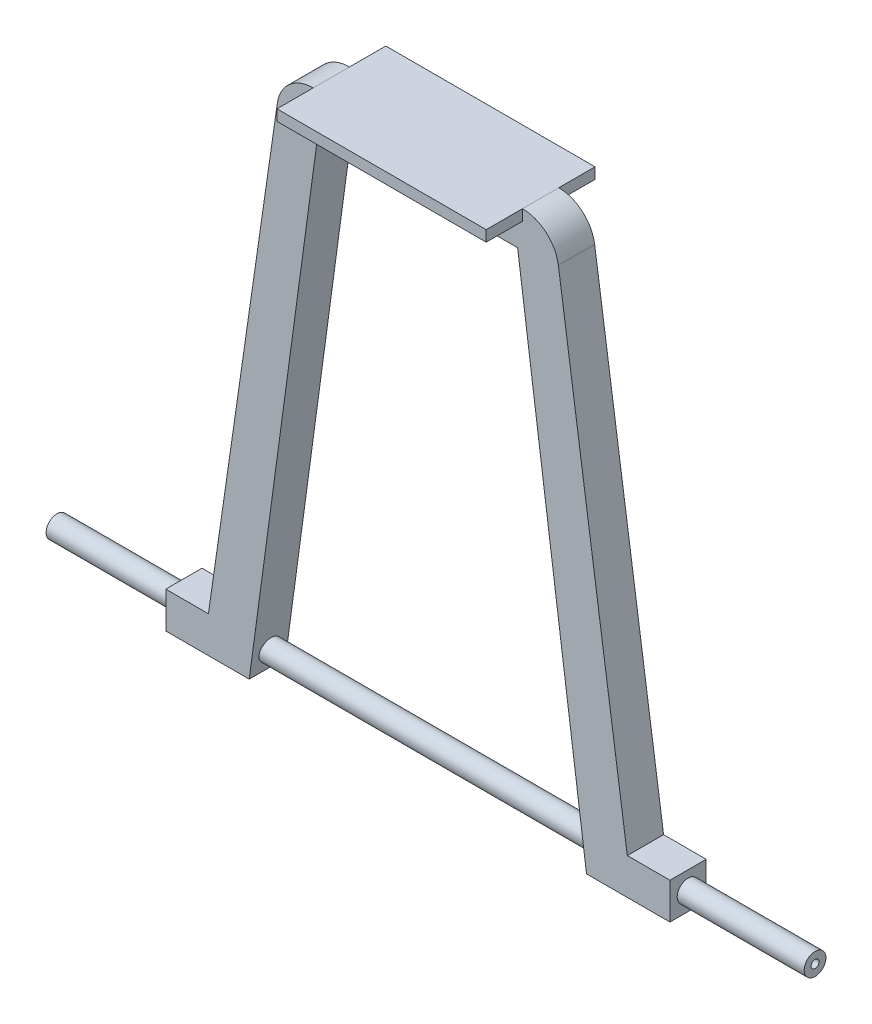
ISO-10303-21;
HEADER;
FILE_DESCRIPTION(('STEP AP214'),'2;1');
FILE_NAME('part.step','',(''),(''),'','','');
FILE_SCHEMA(('AUTOMOTIVE_DESIGN { 1 0 10303 214 1 1 1 1 }'));
ENDSEC;
DATA;
#1=APPLICATION_CONTEXT('core data for automotive mechanical design processes');
#2=APPLICATION_PROTOCOL_DEFINITION('international standard','automotive_design',2000,#1);
#3=PRODUCT_CONTEXT('',#1,'mechanical');
#4=PRODUCT('Part','Part','',(#3));
#5=PRODUCT_RELATED_PRODUCT_CATEGORY('part','',(#4));
#6=PRODUCT_DEFINITION_FORMATION('','',#4);
#7=PRODUCT_DEFINITION_CONTEXT('part definition',#1,'design');
#8=PRODUCT_DEFINITION('design','',#6,#7);
#9=PRODUCT_DEFINITION_SHAPE('','',#8);
#10=(LENGTH_UNIT() NAMED_UNIT(*) SI_UNIT(.MILLI.,.METRE.));
#11=(NAMED_UNIT(*) PLANE_ANGLE_UNIT() SI_UNIT($,.RADIAN.));
#12=(NAMED_UNIT(*) SI_UNIT($,.STERADIAN.) SOLID_ANGLE_UNIT());
#13=UNCERTAINTY_MEASURE_WITH_UNIT(LENGTH_MEASURE(1.E-05),#10,'distance_accuracy_value','');
#14=(GEOMETRIC_REPRESENTATION_CONTEXT(3) GLOBAL_UNCERTAINTY_ASSIGNED_CONTEXT((#13)) GLOBAL_UNIT_ASSIGNED_CONTEXT((#10,
#11,#12)) REPRESENTATION_CONTEXT('',''));
#15=CARTESIAN_POINT('',(0.,0.,0.));
#16=DIRECTION('',(0.,0.,1.));
#17=DIRECTION('',(1.,0.,0.));
#18=AXIS2_PLACEMENT_3D('',#15,#16,#17);
#19=CARTESIAN_POINT('',(0.,0.,10.));
#20=DIRECTION('',(0.,0.,-1.));
#21=DIRECTION('',(-1.,0.,0.));
#22=AXIS2_PLACEMENT_3D('',#19,#20,#21);
#23=PLANE('',#22);
#24=DIRECTION('',(0.,-1.,0.));
#25=VECTOR('',#24,1.);
#26=CARTESIAN_POINT('',(97.,0.,10.));
#27=LINE('',#26,#25);
#28=CARTESIAN_POINT('',(97.,-130.,10.));
#29=VERTEX_POINT('',#28);
#30=CARTESIAN_POINT('',(97.,-140.,10.));
#31=VERTEX_POINT('',#30);
#32=EDGE_CURVE('E181',#29,#31,#27,.T.);
#33=ORIENTED_EDGE('',*,*,#32,.F.);
#34=DIRECTION('',(-1.,0.,0.));
#35=VECTOR('',#34,1.);
#36=CARTESIAN_POINT('',(132.,-130.,10.));
#37=LINE('',#36,#35);
#38=CARTESIAN_POINT('',(85.2425475761112,-130.,10.));
#39=VERTEX_POINT('',#38);
#40=EDGE_CURVE('E191',#29,#39,#37,.T.);
#41=ORIENTED_EDGE('',*,*,#40,.T.);
#42=DIRECTION('',(0.143101511466158,-0.989708016243226,0.));
#43=VECTOR('',#42,1.);
#44=CARTESIAN_POINT('',(66.2389863158603,1.43101511466158,10.));
#45=LINE('',#44,#43);
#46=CARTESIAN_POINT('',(66.2389863158603,1.43101511466158,10.));
#47=VERTEX_POINT('',#46);
#48=EDGE_CURVE('E234',#47,#39,#45,.T.);
#49=ORIENTED_EDGE('',*,*,#48,.F.);
#50=CARTESIAN_POINT('',(56.341906153428,0.,10.));
#51=DIRECTION('',(0.,0.,1.));
#52=DIRECTION('',(1.,0.,0.));
#53=AXIS2_PLACEMENT_3D('',#50,#51,#52);
#54=CIRCLE('',#53,10.);
#55=CARTESIAN_POINT('',(56.341906153428,10.,10.));
#56=VERTEX_POINT('',#55);
#57=EDGE_CURVE('E208',#47,#56,#54,.T.);
#58=ORIENTED_EDGE('',*,*,#57,.T.);
#59=DIRECTION('',(0.,-1.,0.));
#60=VECTOR('',#59,1.);
#61=CARTESIAN_POINT('',(56.341906153428,0.,10.));
#62=LINE('',#61,#60);
#63=CARTESIAN_POINT('',(56.341906153428,7.,10.));
#64=VERTEX_POINT('',#63);
#65=EDGE_CURVE('E348',#56,#64,#62,.T.);
#66=ORIENTED_EDGE('',*,*,#65,.T.);
#67=DIRECTION('',(1.,0.,0.));
#68=VECTOR('',#67,1.);
#69=CARTESIAN_POINT('',(0.,7.,10.));
#70=LINE('',#69,#68);
#71=CARTESIAN_POINT('',(-1.34190615342804,7.,10.));
#72=VERTEX_POINT('',#71);
#73=EDGE_CURVE('E336',#72,#64,#70,.T.);
#74=ORIENTED_EDGE('',*,*,#73,.F.);
#75=DIRECTION('',(0.,1.,0.));
#76=VECTOR('',#75,1.);
#77=CARTESIAN_POINT('',(-1.34190615342803,0.,10.));
#78=LINE('',#77,#76);
#79=CARTESIAN_POINT('',(-1.34190615342803,10.,10.));
#80=VERTEX_POINT('',#79);
#81=EDGE_CURVE('E339',#72,#80,#78,.T.);
#82=ORIENTED_EDGE('',*,*,#81,.T.);
#83=CARTESIAN_POINT('',(-1.34190615342803,0.,10.));
#84=DIRECTION('',(0.,0.,-1.));
#85=DIRECTION('',(-1.,0.,0.));
#86=AXIS2_PLACEMENT_3D('',#83,#84,#85);
#87=CIRCLE('',#86,10.);
#88=CARTESIAN_POINT('',(-11.2389863158603,1.43101511466158,10.));
#89=VERTEX_POINT('',#88);
#90=EDGE_CURVE('E250',#89,#80,#87,.T.);
#91=ORIENTED_EDGE('',*,*,#90,.F.);
#92=DIRECTION('',(-0.143101511466158,-0.989708016243226,0.));
#93=VECTOR('',#92,1.);
#94=CARTESIAN_POINT('',(-11.2389863158603,1.43101511466158,10.));
#95=LINE('',#94,#93);
#96=CARTESIAN_POINT('',(-30.2425475761112,-130.,10.));
#97=VERTEX_POINT('',#96);
#98=EDGE_CURVE('E256',#89,#97,#95,.T.);
#99=ORIENTED_EDGE('',*,*,#98,.T.);
#100=DIRECTION('',(1.,0.,0.));
#101=VECTOR('',#100,1.);
#102=CARTESIAN_POINT('',(-77.,-130.,10.));
#103=LINE('',#102,#101);
#104=CARTESIAN_POINT('',(-42.,-130.,10.));
#105=VERTEX_POINT('',#104);
#106=EDGE_CURVE('E204',#105,#97,#103,.T.);
#107=ORIENTED_EDGE('',*,*,#106,.F.);
#108=DIRECTION('',(0.,1.,0.));
#109=VECTOR('',#108,1.);
#110=CARTESIAN_POINT('',(-42.,0.,10.));
#111=LINE('',#110,#109);
#112=CARTESIAN_POINT('',(-42.,-140.,10.));
#113=VERTEX_POINT('',#112);
#114=EDGE_CURVE('E68',#113,#105,#111,.T.);
#115=ORIENTED_EDGE('',*,*,#114,.F.);
#116=DIRECTION('',(1.,0.,0.));
#117=VECTOR('',#116,1.);
#118=CARTESIAN_POINT('',(-31.6884438315477,-140.,10.));
#119=LINE('',#118,#117);
#120=CARTESIAN_POINT('',(-18.9930433860189,-140.,10.));
#121=VERTEX_POINT('',#120);
#122=EDGE_CURVE('E274',#113,#121,#119,.T.);
#123=ORIENTED_EDGE('',*,*,#122,.T.);
#124=DIRECTION('',(-0.134433123138436,-0.990922668730132,0.));
#125=VECTOR('',#124,1.);
#126=CARTESIAN_POINT('',(0.,0.,10.));
#127=LINE('',#126,#125);
#128=CARTESIAN_POINT('',(0.,0.,10.));
#129=VERTEX_POINT('',#128);
#130=EDGE_CURVE('E270',#129,#121,#127,.T.);
#131=ORIENTED_EDGE('',*,*,#130,.F.);
#132=DIRECTION('',(1.,0.,0.));
#133=VECTOR('',#132,1.);
#134=CARTESIAN_POINT('',(0.,0.,10.));
#135=LINE('',#134,#133);
#136=CARTESIAN_POINT('',(55.,0.,10.));
#137=VERTEX_POINT('',#136);
#138=EDGE_CURVE('E291',#129,#137,#135,.T.);
#139=ORIENTED_EDGE('',*,*,#138,.T.);
#140=DIRECTION('',(0.134433123138436,-0.990922668730132,0.));
#141=VECTOR('',#140,1.);
#142=CARTESIAN_POINT('',(55.,0.,10.));
#143=LINE('',#142,#141);
#144=CARTESIAN_POINT('',(73.9930433860189,-140.,10.));
#145=VERTEX_POINT('',#144);
#146=EDGE_CURVE('E219',#137,#145,#143,.T.);
#147=ORIENTED_EDGE('',*,*,#146,.T.);
#148=DIRECTION('',(-1.,0.,0.));
#149=VECTOR('',#148,1.);
#150=CARTESIAN_POINT('',(86.6884438315477,-140.,10.));
#151=LINE('',#150,#149);
#152=EDGE_CURVE('E194',#31,#145,#151,.T.);
#153=ORIENTED_EDGE('',*,*,#152,.F.);
#154=EDGE_LOOP('',(#33,#41,#49,#58,#66,#74,#82,#91,#99,#107,#115,#123,#131,#139,#147,#153));
#155=FACE_BOUND('',#154,.T.);
#156=ADVANCED_FACE('F42',(#155),#23,.F.);
#157=CARTESIAN_POINT('',(0.,0.,0.));
#158=DIRECTION('',(0.,0.,-1.));
#159=DIRECTION('',(-1.,0.,0.));
#160=AXIS2_PLACEMENT_3D('',#157,#158,#159);
#161=PLANE('',#160);
#162=DIRECTION('',(-1.,0.,0.));
#163=VECTOR('',#162,1.);
#164=CARTESIAN_POINT('',(132.,-130.,0.));
#165=LINE('',#164,#163);
#166=CARTESIAN_POINT('',(97.,-130.,0.));
#167=VERTEX_POINT('',#166);
#168=CARTESIAN_POINT('',(85.2425475761111,-130.,0.));
#169=VERTEX_POINT('',#168);
#170=EDGE_CURVE('E203',#167,#169,#165,.T.);
#171=ORIENTED_EDGE('',*,*,#170,.F.);
#172=DIRECTION('',(0.,-1.,0.));
#173=VECTOR('',#172,1.);
#174=CARTESIAN_POINT('',(97.,0.,0.));
#175=LINE('',#174,#173);
#176=CARTESIAN_POINT('',(97.,-140.,0.));
#177=VERTEX_POINT('',#176);
#178=EDGE_CURVE('E60',#167,#177,#175,.T.);
#179=ORIENTED_EDGE('',*,*,#178,.T.);
#180=DIRECTION('',(-1.,0.,0.));
#181=VECTOR('',#180,1.);
#182=CARTESIAN_POINT('',(86.6884438315477,-140.,0.));
#183=LINE('',#182,#181);
#184=CARTESIAN_POINT('',(73.9930433860189,-140.,0.));
#185=VERTEX_POINT('',#184);
#186=EDGE_CURVE('E223',#177,#185,#183,.T.);
#187=ORIENTED_EDGE('',*,*,#186,.T.);
#188=DIRECTION('',(0.134433123138436,-0.990922668730132,0.));
#189=VECTOR('',#188,1.);
#190=CARTESIAN_POINT('',(55.,0.,0.));
#191=LINE('',#190,#189);
#192=CARTESIAN_POINT('',(55.,0.,0.));
#193=VERTEX_POINT('',#192);
#194=EDGE_CURVE('E226',#193,#185,#191,.T.);
#195=ORIENTED_EDGE('',*,*,#194,.F.);
#196=DIRECTION('',(1.,0.,0.));
#197=VECTOR('',#196,1.);
#198=CARTESIAN_POINT('',(0.,0.,0.));
#199=LINE('',#198,#197);
#200=CARTESIAN_POINT('',(0.,0.,0.));
#201=VERTEX_POINT('',#200);
#202=EDGE_CURVE('E290',#201,#193,#199,.T.);
#203=ORIENTED_EDGE('',*,*,#202,.F.);
#204=DIRECTION('',(-0.134433123138436,-0.990922668730132,0.));
#205=VECTOR('',#204,1.);
#206=CARTESIAN_POINT('',(0.,0.,0.));
#207=LINE('',#206,#205);
#208=CARTESIAN_POINT('',(-18.9930433860189,-140.,0.));
#209=VERTEX_POINT('',#208);
#210=EDGE_CURVE('E255',#201,#209,#207,.T.);
#211=ORIENTED_EDGE('',*,*,#210,.T.);
#212=DIRECTION('',(1.,0.,0.));
#213=VECTOR('',#212,1.);
#214=CARTESIAN_POINT('',(-31.6884438315477,-140.,0.));
#215=LINE('',#214,#213);
#216=CARTESIAN_POINT('',(-42.,-140.,0.));
#217=VERTEX_POINT('',#216);
#218=EDGE_CURVE('E260',#217,#209,#215,.T.);
#219=ORIENTED_EDGE('',*,*,#218,.F.);
#220=DIRECTION('',(0.,1.,0.));
#221=VECTOR('',#220,1.);
#222=CARTESIAN_POINT('',(-42.,0.,0.));
#223=LINE('',#222,#221);
#224=CARTESIAN_POINT('',(-42.,-130.,0.));
#225=VERTEX_POINT('',#224);
#226=EDGE_CURVE('E334',#217,#225,#223,.T.);
#227=ORIENTED_EDGE('',*,*,#226,.T.);
#228=DIRECTION('',(1.,0.,0.));
#229=VECTOR('',#228,1.);
#230=CARTESIAN_POINT('',(-77.,-130.,0.));
#231=LINE('',#230,#229);
#232=CARTESIAN_POINT('',(-30.2425475761112,-130.,0.));
#233=VERTEX_POINT('',#232);
#234=EDGE_CURVE('E210',#225,#233,#231,.T.);
#235=ORIENTED_EDGE('',*,*,#234,.T.);
#236=DIRECTION('',(-0.143101511466158,-0.989708016243226,0.));
#237=VECTOR('',#236,1.);
#238=CARTESIAN_POINT('',(-11.2389863158603,1.43101511466158,0.));
#239=LINE('',#238,#237);
#240=CARTESIAN_POINT('',(-11.2389863158603,1.43101511466158,0.));
#241=VERTEX_POINT('',#240);
#242=EDGE_CURVE('E263',#241,#233,#239,.T.);
#243=ORIENTED_EDGE('',*,*,#242,.F.);
#244=CARTESIAN_POINT('',(-1.34190615342803,0.,0.));
#245=DIRECTION('',(0.,0.,-1.));
#246=DIRECTION('',(-1.,0.,0.));
#247=AXIS2_PLACEMENT_3D('',#244,#245,#246);
#248=CIRCLE('',#247,10.);
#249=CARTESIAN_POINT('',(-1.34190615342804,10.,0.));
#250=VERTEX_POINT('',#249);
#251=EDGE_CURVE('E251',#241,#250,#248,.T.);
#252=ORIENTED_EDGE('',*,*,#251,.T.);
#253=DIRECTION('',(0.,1.,0.));
#254=VECTOR('',#253,1.);
#255=CARTESIAN_POINT('',(-1.34190615342803,0.,0.));
#256=LINE('',#255,#254);
#257=CARTESIAN_POINT('',(-1.34190615342803,7.,0.));
#258=VERTEX_POINT('',#257);
#259=EDGE_CURVE('E344',#258,#250,#256,.T.);
#260=ORIENTED_EDGE('',*,*,#259,.F.);
#261=DIRECTION('',(1.,0.,0.));
#262=VECTOR('',#261,1.);
#263=CARTESIAN_POINT('',(0.,7.,0.));
#264=LINE('',#263,#262);
#265=CARTESIAN_POINT('',(56.341906153428,7.,0.));
#266=VERTEX_POINT('',#265);
#267=EDGE_CURVE('E310',#258,#266,#264,.T.);
#268=ORIENTED_EDGE('',*,*,#267,.T.);
#269=DIRECTION('',(0.,-1.,0.));
#270=VECTOR('',#269,1.);
#271=CARTESIAN_POINT('',(56.341906153428,0.,0.));
#272=LINE('',#271,#270);
#273=CARTESIAN_POINT('',(56.341906153428,10.,0.));
#274=VERTEX_POINT('',#273);
#275=EDGE_CURVE('E351',#274,#266,#272,.T.);
#276=ORIENTED_EDGE('',*,*,#275,.F.);
#277=CARTESIAN_POINT('',(56.341906153428,0.,0.));
#278=DIRECTION('',(0.,0.,1.));
#279=DIRECTION('',(1.,0.,0.));
#280=AXIS2_PLACEMENT_3D('',#277,#278,#279);
#281=CIRCLE('',#280,10.);
#282=CARTESIAN_POINT('',(66.2389863158603,1.43101511466158,0.));
#283=VERTEX_POINT('',#282);
#284=EDGE_CURVE('E214',#283,#274,#281,.T.);
#285=ORIENTED_EDGE('',*,*,#284,.F.);
#286=DIRECTION('',(0.143101511466158,-0.989708016243226,0.));
#287=VECTOR('',#286,1.);
#288=CARTESIAN_POINT('',(66.2389863158603,1.43101511466158,0.));
#289=LINE('',#288,#287);
#290=EDGE_CURVE('E218',#283,#169,#289,.T.);
#291=ORIENTED_EDGE('',*,*,#290,.T.);
#292=EDGE_LOOP('',(#171,#179,#187,#195,#203,#211,#219,#227,#235,#243,#252,#260,#268,#276,#285,#291));
#293=FACE_BOUND('',#292,.T.);
#294=ADVANCED_FACE('F330',(#293),#161,.T.);
#295=CARTESIAN_POINT('',(86.6884438315477,-140.,0.));
#296=DIRECTION('',(0.,1.,0.));
#297=DIRECTION('',(-1.,0.,0.));
#298=AXIS2_PLACEMENT_3D('',#295,#296,#297);
#299=PLANE('',#298);
#300=DIRECTION('',(0.,0.,-1.));
#301=VECTOR('',#300,1.);
#302=CARTESIAN_POINT('',(97.,-140.,0.));
#303=LINE('',#302,#301);
#304=EDGE_CURVE('E196',#31,#177,#303,.T.);
#305=ORIENTED_EDGE('',*,*,#304,.F.);
#306=ORIENTED_EDGE('',*,*,#152,.T.);
#307=DIRECTION('',(0.,0.,1.));
#308=VECTOR('',#307,1.);
#309=CARTESIAN_POINT('',(73.9930433860189,-140.,0.));
#310=LINE('',#309,#308);
#311=EDGE_CURVE('E243',#185,#145,#310,.T.);
#312=ORIENTED_EDGE('',*,*,#311,.F.);
#313=ORIENTED_EDGE('',*,*,#186,.F.);
#314=EDGE_LOOP('',(#305,#306,#312,#313));
#315=FACE_BOUND('',#314,.T.);
#316=ADVANCED_FACE('F461',(#315),#299,.F.);
#317=CARTESIAN_POINT('',(132.,-130.,10.));
#318=DIRECTION('',(0.,-1.,0.));
#319=DIRECTION('',(0.,0.,-1.));
#320=AXIS2_PLACEMENT_3D('',#317,#318,#319);
#321=PLANE('',#320);
#322=DIRECTION('',(0.,0.,1.));
#323=VECTOR('',#322,1.);
#324=CARTESIAN_POINT('',(97.,-130.,10.));
#325=LINE('',#324,#323);
#326=EDGE_CURVE('E52',#167,#29,#325,.T.);
#327=ORIENTED_EDGE('',*,*,#326,.F.);
#328=ORIENTED_EDGE('',*,*,#170,.T.);
#329=DIRECTION('',(0.,0.,1.));
#330=VECTOR('',#329,1.);
#331=CARTESIAN_POINT('',(85.2425475761111,-130.,0.));
#332=LINE('',#331,#330);
#333=EDGE_CURVE('E201',#169,#39,#332,.T.);
#334=ORIENTED_EDGE('',*,*,#333,.T.);
#335=ORIENTED_EDGE('',*,*,#40,.F.);
#336=EDGE_LOOP('',(#327,#328,#334,#335));
#337=FACE_BOUND('',#336,.T.);
#338=ADVANCED_FACE('F199',(#337),#321,.F.);
#339=CARTESIAN_POINT('',(-31.6884438315477,-140.,0.));
#340=DIRECTION('',(0.,-1.,0.));
#341=DIRECTION('',(1.,0.,0.));
#342=AXIS2_PLACEMENT_3D('',#339,#340,#341);
#343=PLANE('',#342);
#344=ORIENTED_EDGE('',*,*,#122,.F.);
#345=DIRECTION('',(0.,0.,-1.));
#346=VECTOR('',#345,1.);
#347=CARTESIAN_POINT('',(-42.,-140.,0.));
#348=LINE('',#347,#346);
#349=EDGE_CURVE('E403',#113,#217,#348,.T.);
#350=ORIENTED_EDGE('',*,*,#349,.T.);
#351=ORIENTED_EDGE('',*,*,#218,.T.);
#352=DIRECTION('',(0.,0.,1.));
#353=VECTOR('',#352,1.);
#354=CARTESIAN_POINT('',(-18.9930433860189,-140.,0.));
#355=LINE('',#354,#353);
#356=EDGE_CURVE('E282',#209,#121,#355,.T.);
#357=ORIENTED_EDGE('',*,*,#356,.T.);
#358=EDGE_LOOP('',(#344,#350,#351,#357));
#359=FACE_BOUND('',#358,.T.);
#360=ADVANCED_FACE('F548',(#359),#343,.T.);
#361=CARTESIAN_POINT('',(-77.,-130.,10.));
#362=DIRECTION('',(0.,1.,0.));
#363=DIRECTION('',(0.,0.,1.));
#364=AXIS2_PLACEMENT_3D('',#361,#362,#363);
#365=PLANE('',#364);
#366=ORIENTED_EDGE('',*,*,#234,.F.);
#367=DIRECTION('',(0.,0.,1.));
#368=VECTOR('',#367,1.);
#369=CARTESIAN_POINT('',(-42.,-130.,10.));
#370=LINE('',#369,#368);
#371=EDGE_CURVE('E187',#225,#105,#370,.T.);
#372=ORIENTED_EDGE('',*,*,#371,.T.);
#373=ORIENTED_EDGE('',*,*,#106,.T.);
#374=DIRECTION('',(0.,0.,-1.));
#375=VECTOR('',#374,1.);
#376=CARTESIAN_POINT('',(-30.2425475761112,-130.,0.));
#377=LINE('',#376,#375);
#378=EDGE_CURVE('E306',#97,#233,#377,.T.);
#379=ORIENTED_EDGE('',*,*,#378,.T.);
#380=EDGE_LOOP('',(#366,#372,#373,#379));
#381=FACE_BOUND('',#380,.T.);
#382=ADVANCED_FACE('F318',(#381),#365,.T.);
#383=CARTESIAN_POINT('',(66.2389863158603,1.43101511466158,0.));
#384=DIRECTION('',(-0.989708016243226,-0.143101511466158,0.));
#385=DIRECTION('',(0.143101511466158,-0.989708016243226,0.));
#386=AXIS2_PLACEMENT_3D('',#383,#384,#385);
#387=PLANE('',#386);
#388=ORIENTED_EDGE('',*,*,#333,.F.);
#389=ORIENTED_EDGE('',*,*,#290,.F.);
#390=DIRECTION('',(0.,0.,1.));
#391=VECTOR('',#390,1.);
#392=CARTESIAN_POINT('',(66.2389863158603,1.43101511466158,0.));
#393=LINE('',#392,#391);
#394=EDGE_CURVE('E247',#283,#47,#393,.T.);
#395=ORIENTED_EDGE('',*,*,#394,.T.);
#396=ORIENTED_EDGE('',*,*,#48,.T.);
#397=EDGE_LOOP('',(#388,#389,#395,#396));
#398=FACE_BOUND('',#397,.T.);
#399=ADVANCED_FACE('F475',(#398),#387,.F.);
#400=CARTESIAN_POINT('',(0.,0.,10.));
#401=DIRECTION('',(0.,1.,0.));
#402=DIRECTION('',(0.,0.,1.));
#403=AXIS2_PLACEMENT_3D('',#400,#401,#402);
#404=PLANE('',#403);
#405=ORIENTED_EDGE('',*,*,#202,.T.);
#406=DIRECTION('',(0.,0.,-1.));
#407=VECTOR('',#406,1.);
#408=CARTESIAN_POINT('',(55.,0.,10.));
#409=LINE('',#408,#407);
#410=EDGE_CURVE('E294',#137,#193,#409,.T.);
#411=ORIENTED_EDGE('',*,*,#410,.F.);
#412=ORIENTED_EDGE('',*,*,#138,.F.);
#413=DIRECTION('',(0.,0.,-1.));
#414=VECTOR('',#413,1.);
#415=CARTESIAN_POINT('',(0.,0.,10.));
#416=LINE('',#415,#414);
#417=EDGE_CURVE('E300',#129,#201,#416,.T.);
#418=ORIENTED_EDGE('',*,*,#417,.T.);
#419=EDGE_LOOP('',(#405,#411,#412,#418));
#420=FACE_BOUND('',#419,.T.);
#421=ADVANCED_FACE('F44',(#420),#404,.F.);
#422=CARTESIAN_POINT('',(0.,10.,10.));
#423=DIRECTION('',(0.,-1.,0.));
#424=DIRECTION('',(0.,0.,-1.));
#425=AXIS2_PLACEMENT_3D('',#422,#423,#424);
#426=PLANE('',#425);
#427=DIRECTION('',(0.,0.,1.));
#428=VECTOR('',#427,1.);
#429=CARTESIAN_POINT('',(56.341906153428,10.,0.));
#430=LINE('',#429,#428);
#431=EDGE_CURVE('E230',#274,#56,#430,.T.);
#432=ORIENTED_EDGE('',*,*,#431,.F.);
#433=DIRECTION('',(0.,0.,-1.));
#434=VECTOR('',#433,1.);
#435=CARTESIAN_POINT('',(56.341906153428,10.,-10.));
#436=LINE('',#435,#434);
#437=CARTESIAN_POINT('',(56.341906153428,10.,-10.));
#438=VERTEX_POINT('',#437);
#439=EDGE_CURVE('E386',#274,#438,#436,.T.);
#440=ORIENTED_EDGE('',*,*,#439,.T.);
#441=DIRECTION('',(-1.,0.,0.));
#442=VECTOR('',#441,1.);
#443=CARTESIAN_POINT('',(-1.34190615342804,10.,-10.));
#444=LINE('',#443,#442);
#445=CARTESIAN_POINT('',(-1.34190615342804,10.,-10.));
#446=VERTEX_POINT('',#445);
#447=EDGE_CURVE('E378',#438,#446,#444,.T.);
#448=ORIENTED_EDGE('',*,*,#447,.T.);
#449=DIRECTION('',(0.,0.,1.));
#450=VECTOR('',#449,1.);
#451=CARTESIAN_POINT('',(-1.34190615342804,10.,-10.));
#452=LINE('',#451,#450);
#453=EDGE_CURVE('E374',#446,#250,#452,.T.);
#454=ORIENTED_EDGE('',*,*,#453,.T.);
#455=DIRECTION('',(0.,0.,1.));
#456=VECTOR('',#455,1.);
#457=CARTESIAN_POINT('',(-1.34190615342804,10.,0.));
#458=LINE('',#457,#456);
#459=EDGE_CURVE('E286',#250,#80,#458,.T.);
#460=ORIENTED_EDGE('',*,*,#459,.T.);
#461=CARTESIAN_POINT('',(-1.34190615342803,10.,20.));
#462=VERTEX_POINT('',#461);
#463=EDGE_CURVE('E377',#80,#462,#452,.T.);
#464=ORIENTED_EDGE('',*,*,#463,.T.);
#465=DIRECTION('',(1.,0.,0.));
#466=VECTOR('',#465,1.);
#467=CARTESIAN_POINT('',(-1.34190615342803,10.,20.));
#468=LINE('',#467,#466);
#469=CARTESIAN_POINT('',(56.341906153428,10.,20.));
#470=VERTEX_POINT('',#469);
#471=EDGE_CURVE('E369',#462,#470,#468,.T.);
#472=ORIENTED_EDGE('',*,*,#471,.T.);
#473=EDGE_CURVE('E382',#470,#56,#436,.T.);
#474=ORIENTED_EDGE('',*,*,#473,.T.);
#475=EDGE_LOOP('',(#432,#440,#448,#454,#460,#464,#472,#474));
#476=FACE_BOUND('',#475,.T.);
#477=ADVANCED_FACE('F466',(#476),#426,.F.);
#478=CARTESIAN_POINT('',(-1.34190615342803,0.,0.));
#479=DIRECTION('',(0.,0.,1.));
#480=DIRECTION('',(1.,0.,0.));
#481=AXIS2_PLACEMENT_3D('',#478,#479,#480);
#482=CYLINDRICAL_SURFACE('',#481,10.);
#483=ORIENTED_EDGE('',*,*,#90,.T.);
#484=ORIENTED_EDGE('',*,*,#459,.F.);
#485=ORIENTED_EDGE('',*,*,#251,.F.);
#486=DIRECTION('',(0.,0.,1.));
#487=VECTOR('',#486,1.);
#488=CARTESIAN_POINT('',(-11.2389863158603,1.43101511466158,0.));
#489=LINE('',#488,#487);
#490=EDGE_CURVE('E267',#241,#89,#489,.T.);
#491=ORIENTED_EDGE('',*,*,#490,.T.);
#492=EDGE_LOOP('',(#483,#484,#485,#491));
#493=FACE_BOUND('',#492,.T.);
#494=ADVANCED_FACE('F464',(#493),#482,.T.);
#495=CARTESIAN_POINT('',(0.,0.,0.));
#496=DIRECTION('',(-0.990922668730132,0.134433123138436,0.));
#497=DIRECTION('',(-0.134433123138436,-0.990922668730132,0.));
#498=AXIS2_PLACEMENT_3D('',#495,#496,#497);
#499=PLANE('',#498);
#500=CARTESIAN_POINT('',(-18.3147204079468,-135.,5.));
#501=DIRECTION('',(-0.990922668730132,0.134433123138436,0.));
#502=DIRECTION('',(0.134433123138436,0.990922668730132,0.));
#503=AXIS2_PLACEMENT_3D('',#500,#501,#502);
#504=ELLIPSE('',#503,3.02748145205368,3.);
#505=CARTESIAN_POINT('',(-17.9077266211035,-132.,5.));
#506=VERTEX_POINT('',#505);
#507=EDGE_CURVE('E428',#506,#506,#504,.T.);
#508=ORIENTED_EDGE('',*,*,#507,.T.);
#509=EDGE_LOOP('',(#508));
#510=FACE_BOUND('',#509,.T.);
#511=ORIENTED_EDGE('',*,*,#130,.T.);
#512=ORIENTED_EDGE('',*,*,#356,.F.);
#513=ORIENTED_EDGE('',*,*,#210,.F.);
#514=ORIENTED_EDGE('',*,*,#417,.F.);
#515=EDGE_LOOP('',(#511,#512,#513,#514));
#516=FACE_BOUND('',#515,.T.);
#517=ADVANCED_FACE('F473',(#510,#516),#499,.F.);
#518=CARTESIAN_POINT('',(-11.2389863158603,1.43101511466158,0.));
#519=DIRECTION('',(-0.989708016243226,0.143101511466158,0.));
#520=DIRECTION('',(-0.143101511466158,-0.989708016243226,0.));
#521=AXIS2_PLACEMENT_3D('',#518,#519,#520);
#522=PLANE('',#521);
#523=ORIENTED_EDGE('',*,*,#378,.F.);
#524=ORIENTED_EDGE('',*,*,#98,.F.);
#525=ORIENTED_EDGE('',*,*,#490,.F.);
#526=ORIENTED_EDGE('',*,*,#242,.T.);
#527=EDGE_LOOP('',(#523,#524,#525,#526));
#528=FACE_BOUND('',#527,.T.);
#529=ADVANCED_FACE('F326',(#528),#522,.T.);
#530=CARTESIAN_POINT('',(56.341906153428,0.,0.));
#531=DIRECTION('',(0.,0.,1.));
#532=DIRECTION('',(1.,0.,0.));
#533=AXIS2_PLACEMENT_3D('',#530,#531,#532);
#534=CYLINDRICAL_SURFACE('',#533,10.);
#535=ORIENTED_EDGE('',*,*,#57,.F.);
#536=ORIENTED_EDGE('',*,*,#394,.F.);
#537=ORIENTED_EDGE('',*,*,#284,.T.);
#538=ORIENTED_EDGE('',*,*,#431,.T.);
#539=EDGE_LOOP('',(#535,#536,#537,#538));
#540=FACE_BOUND('',#539,.T.);
#541=ADVANCED_FACE('F482',(#540),#534,.T.);
#542=CARTESIAN_POINT('',(55.,0.,0.));
#543=DIRECTION('',(-0.990922668730132,-0.134433123138436,0.));
#544=DIRECTION('',(0.134433123138436,-0.990922668730132,0.));
#545=AXIS2_PLACEMENT_3D('',#542,#543,#544);
#546=PLANE('',#545);
#547=CARTESIAN_POINT('',(73.3147204079468,-135.,5.));
#548=DIRECTION('',(-0.990922668730132,-0.134433123138436,0.));
#549=DIRECTION('',(0.134433123138436,-0.990922668730132,0.));
#550=AXIS2_PLACEMENT_3D('',#547,#548,#549);
#551=ELLIPSE('',#550,3.02748145205368,3.);
#552=CARTESIAN_POINT('',(73.72171419479,-138.,5.));
#553=VERTEX_POINT('',#552);
#554=EDGE_CURVE('E12',#553,#553,#551,.T.);
#555=ORIENTED_EDGE('',*,*,#554,.F.);
#556=EDGE_LOOP('',(#555));
#557=FACE_BOUND('',#556,.T.);
#558=ORIENTED_EDGE('',*,*,#146,.F.);
#559=ORIENTED_EDGE('',*,*,#410,.T.);
#560=ORIENTED_EDGE('',*,*,#194,.T.);
#561=ORIENTED_EDGE('',*,*,#311,.T.);
#562=EDGE_LOOP('',(#558,#559,#560,#561));
#563=FACE_BOUND('',#562,.T.);
#564=ADVANCED_FACE('F531',(#557,#563),#546,.T.);
#565=CARTESIAN_POINT('',(-1.34190615342804,7.,-10.));
#566=DIRECTION('',(0.,0.,-1.));
#567=DIRECTION('',(-1.,0.,0.));
#568=AXIS2_PLACEMENT_3D('',#565,#566,#567);
#569=PLANE('',#568);
#570=ORIENTED_EDGE('',*,*,#447,.F.);
#571=DIRECTION('',(0.,1.,0.));
#572=VECTOR('',#571,1.);
#573=CARTESIAN_POINT('',(56.341906153428,7.,-10.));
#574=LINE('',#573,#572);
#575=CARTESIAN_POINT('',(56.341906153428,7.,-10.));
#576=VERTEX_POINT('',#575);
#577=EDGE_CURVE('E355',#576,#438,#574,.T.);
#578=ORIENTED_EDGE('',*,*,#577,.F.);
#579=DIRECTION('',(-1.,0.,0.));
#580=VECTOR('',#579,1.);
#581=CARTESIAN_POINT('',(-1.34190615342804,7.,-10.));
#582=LINE('',#581,#580);
#583=CARTESIAN_POINT('',(-1.34190615342804,7.,-10.));
#584=VERTEX_POINT('',#583);
#585=EDGE_CURVE('E395',#576,#584,#582,.T.);
#586=ORIENTED_EDGE('',*,*,#585,.T.);
#587=DIRECTION('',(0.,1.,0.));
#588=VECTOR('',#587,1.);
#589=CARTESIAN_POINT('',(-1.34190615342804,7.,-10.));
#590=LINE('',#589,#588);
#591=EDGE_CURVE('E359',#584,#446,#590,.T.);
#592=ORIENTED_EDGE('',*,*,#591,.T.);
#593=EDGE_LOOP('',(#570,#578,#586,#592));
#594=FACE_BOUND('',#593,.T.);
#595=ADVANCED_FACE('F525',(#594),#569,.T.);
#596=CARTESIAN_POINT('',(0.,7.,0.));
#597=DIRECTION('',(0.,1.,0.));
#598=DIRECTION('',(0.,0.,1.));
#599=AXIS2_PLACEMENT_3D('',#596,#597,#598);
#600=PLANE('',#599);
#601=ORIENTED_EDGE('',*,*,#267,.F.);
#602=DIRECTION('',(0.,0.,1.));
#603=VECTOR('',#602,1.);
#604=CARTESIAN_POINT('',(-1.34190615342804,7.,-10.));
#605=LINE('',#604,#603);
#606=EDGE_CURVE('E390',#584,#258,#605,.T.);
#607=ORIENTED_EDGE('',*,*,#606,.F.);
#608=ORIENTED_EDGE('',*,*,#585,.F.);
#609=DIRECTION('',(0.,0.,-1.));
#610=VECTOR('',#609,1.);
#611=CARTESIAN_POINT('',(56.341906153428,7.,-10.));
#612=LINE('',#611,#610);
#613=EDGE_CURVE('E373',#266,#576,#612,.T.);
#614=ORIENTED_EDGE('',*,*,#613,.F.);
#615=EDGE_LOOP('',(#601,#607,#608,#614));
#616=FACE_BOUND('',#615,.T.);
#617=ADVANCED_FACE('F491',(#616),#600,.F.);
#618=CARTESIAN_POINT('',(-1.34190615342804,7.,-10.));
#619=DIRECTION('',(-1.,0.,0.));
#620=DIRECTION('',(0.,0.,1.));
#621=AXIS2_PLACEMENT_3D('',#618,#619,#620);
#622=PLANE('',#621);
#623=ORIENTED_EDGE('',*,*,#606,.T.);
#624=ORIENTED_EDGE('',*,*,#259,.T.);
#625=ORIENTED_EDGE('',*,*,#453,.F.);
#626=ORIENTED_EDGE('',*,*,#591,.F.);
#627=EDGE_LOOP('',(#623,#624,#625,#626));
#628=FACE_BOUND('',#627,.T.);
#629=ADVANCED_FACE('F520',(#628),#622,.T.);
#630=CARTESIAN_POINT('',(56.341906153428,7.,-10.));
#631=DIRECTION('',(1.,0.,0.));
#632=DIRECTION('',(0.,0.,-1.));
#633=AXIS2_PLACEMENT_3D('',#630,#631,#632);
#634=PLANE('',#633);
#635=ORIENTED_EDGE('',*,*,#439,.F.);
#636=ORIENTED_EDGE('',*,*,#275,.T.);
#637=ORIENTED_EDGE('',*,*,#613,.T.);
#638=ORIENTED_EDGE('',*,*,#577,.T.);
#639=EDGE_LOOP('',(#635,#636,#637,#638));
#640=FACE_BOUND('',#639,.T.);
#641=ADVANCED_FACE('F487',(#640),#634,.T.);
#642=CARTESIAN_POINT('',(-1.34190615342803,7.,20.));
#643=VERTEX_POINT('',#642);
#644=EDGE_CURVE('E394',#72,#643,#605,.T.);
#645=ORIENTED_EDGE('',*,*,#644,.F.);
#646=ORIENTED_EDGE('',*,*,#73,.T.);
#647=CARTESIAN_POINT('',(56.341906153428,7.,20.));
#648=VERTEX_POINT('',#647);
#649=EDGE_CURVE('E399',#648,#64,#612,.T.);
#650=ORIENTED_EDGE('',*,*,#649,.F.);
#651=DIRECTION('',(1.,0.,0.));
#652=VECTOR('',#651,1.);
#653=CARTESIAN_POINT('',(-1.34190615342803,7.,20.));
#654=LINE('',#653,#652);
#655=EDGE_CURVE('E360',#643,#648,#654,.T.);
#656=ORIENTED_EDGE('',*,*,#655,.F.);
#657=EDGE_LOOP('',(#645,#646,#650,#656));
#658=FACE_BOUND('',#657,.T.);
#659=ADVANCED_FACE('F511',(#658),#600,.F.);
#660=ORIENTED_EDGE('',*,*,#81,.F.);
#661=ORIENTED_EDGE('',*,*,#644,.T.);
#662=DIRECTION('',(0.,1.,0.));
#663=VECTOR('',#662,1.);
#664=CARTESIAN_POINT('',(-1.34190615342803,7.,20.));
#665=LINE('',#664,#663);
#666=EDGE_CURVE('E363',#643,#462,#665,.T.);
#667=ORIENTED_EDGE('',*,*,#666,.T.);
#668=ORIENTED_EDGE('',*,*,#463,.F.);
#669=EDGE_LOOP('',(#660,#661,#667,#668));
#670=FACE_BOUND('',#669,.T.);
#671=ADVANCED_FACE('F501',(#670),#622,.T.);
#672=ORIENTED_EDGE('',*,*,#65,.F.);
#673=ORIENTED_EDGE('',*,*,#473,.F.);
#674=DIRECTION('',(0.,1.,0.));
#675=VECTOR('',#674,1.);
#676=CARTESIAN_POINT('',(56.341906153428,7.,20.));
#677=LINE('',#676,#675);
#678=EDGE_CURVE('E354',#648,#470,#677,.T.);
#679=ORIENTED_EDGE('',*,*,#678,.F.);
#680=ORIENTED_EDGE('',*,*,#649,.T.);
#681=EDGE_LOOP('',(#672,#673,#679,#680));
#682=FACE_BOUND('',#681,.T.);
#683=ADVANCED_FACE('F509',(#682),#634,.T.);
#684=CARTESIAN_POINT('',(-1.34190615342803,7.,20.));
#685=DIRECTION('',(0.,0.,1.));
#686=DIRECTION('',(1.,0.,0.));
#687=AXIS2_PLACEMENT_3D('',#684,#685,#686);
#688=PLANE('',#687);
#689=ORIENTED_EDGE('',*,*,#471,.F.);
#690=ORIENTED_EDGE('',*,*,#666,.F.);
#691=ORIENTED_EDGE('',*,*,#655,.T.);
#692=ORIENTED_EDGE('',*,*,#678,.T.);
#693=EDGE_LOOP('',(#689,#690,#691,#692));
#694=FACE_BOUND('',#693,.T.);
#695=ADVANCED_FACE('F505',(#694),#688,.T.);
#696=CARTESIAN_POINT('',(-42.,-65.,5.));
#697=DIRECTION('',(-1.,0.,0.));
#698=DIRECTION('',(0.,0.,1.));
#699=AXIS2_PLACEMENT_3D('',#696,#697,#698);
#700=PLANE('',#699);
#701=ORIENTED_EDGE('',*,*,#114,.T.);
#702=ORIENTED_EDGE('',*,*,#371,.F.);
#703=ORIENTED_EDGE('',*,*,#226,.F.);
#704=ORIENTED_EDGE('',*,*,#349,.F.);
#705=EDGE_LOOP('',(#701,#702,#703,#704));
#706=FACE_BOUND('',#705,.T.);
#707=CARTESIAN_POINT('',(-42.,-135.,5.));
#708=DIRECTION('',(-1.,0.,0.));
#709=DIRECTION('',(0.,0.,1.));
#710=AXIS2_PLACEMENT_3D('',#707,#708,#709);
#711=CIRCLE('',#710,3.);
#712=CARTESIAN_POINT('',(-42.,-135.,8.));
#713=VERTEX_POINT('',#712);
#714=EDGE_CURVE('E411',#713,#713,#711,.T.);
#715=ORIENTED_EDGE('',*,*,#714,.F.);
#716=EDGE_LOOP('',(#715));
#717=FACE_BOUND('',#716,.T.);
#718=ADVANCED_FACE('F582',(#706,#717),#700,.T.);
#719=CARTESIAN_POINT('',(-42.,-135.,5.));
#720=DIRECTION('',(-1.,0.,0.));
#721=DIRECTION('',(0.,0.,1.));
#722=AXIS2_PLACEMENT_3D('',#719,#720,#721);
#723=CYLINDRICAL_SURFACE('',#722,3.);
#724=ORIENTED_EDGE('',*,*,#714,.T.);
#725=EDGE_LOOP('',(#724));
#726=FACE_BOUND('',#725,.T.);
#727=CARTESIAN_POINT('',(-77.,-135.,5.));
#728=DIRECTION('',(-1.,0.,0.));
#729=DIRECTION('',(0.,0.,1.));
#730=AXIS2_PLACEMENT_3D('',#727,#728,#729);
#731=CIRCLE('',#730,3.);
#732=CARTESIAN_POINT('',(-77.,-135.,8.));
#733=VERTEX_POINT('',#732);
#734=EDGE_CURVE('E412',#733,#733,#731,.T.);
#735=ORIENTED_EDGE('',*,*,#734,.F.);
#736=EDGE_LOOP('',(#735));
#737=FACE_BOUND('',#736,.T.);
#738=ADVANCED_FACE('F544',(#726,#737),#723,.T.);
#739=CARTESIAN_POINT('',(-77.,0.,0.));
#740=DIRECTION('',(1.,0.,0.));
#741=DIRECTION('',(0.,0.,1.));
#742=AXIS2_PLACEMENT_3D('',#739,#740,#741);
#743=PLANE('',#742);
#744=CARTESIAN_POINT('',(-77.,-135.,5.));
#745=DIRECTION('',(-1.,0.,0.));
#746=DIRECTION('',(0.,0.,1.));
#747=AXIS2_PLACEMENT_3D('',#744,#745,#746);
#748=CIRCLE('',#747,1.1);
#749=CARTESIAN_POINT('',(-77.,-135.,6.1));
#750=VERTEX_POINT('',#749);
#751=EDGE_CURVE('E435',#750,#750,#748,.T.);
#752=ORIENTED_EDGE('',*,*,#751,.F.);
#753=EDGE_LOOP('',(#752));
#754=FACE_BOUND('',#753,.T.);
#755=ORIENTED_EDGE('',*,*,#734,.T.);
#756=EDGE_LOOP('',(#755));
#757=FACE_BOUND('',#756,.T.);
#758=ADVANCED_FACE('F541',(#754,#757),#743,.F.);
#759=CARTESIAN_POINT('',(97.,-65.,5.));
#760=DIRECTION('',(1.,0.,0.));
#761=DIRECTION('',(0.,0.,-1.));
#762=AXIS2_PLACEMENT_3D('',#759,#760,#761);
#763=PLANE('',#762);
#764=CARTESIAN_POINT('',(97.,-135.,5.));
#765=DIRECTION('',(1.,0.,0.));
#766=DIRECTION('',(0.,0.,-1.));
#767=AXIS2_PLACEMENT_3D('',#764,#765,#766);
#768=CIRCLE('',#767,3.);
#769=CARTESIAN_POINT('',(97.,-135.,2.));
#770=VERTEX_POINT('',#769);
#771=EDGE_CURVE('E423',#770,#770,#768,.T.);
#772=ORIENTED_EDGE('',*,*,#771,.F.);
#773=EDGE_LOOP('',(#772));
#774=FACE_BOUND('',#773,.T.);
#775=ORIENTED_EDGE('',*,*,#304,.T.);
#776=ORIENTED_EDGE('',*,*,#178,.F.);
#777=ORIENTED_EDGE('',*,*,#326,.T.);
#778=ORIENTED_EDGE('',*,*,#32,.T.);
#779=EDGE_LOOP('',(#775,#776,#777,#778));
#780=FACE_BOUND('',#779,.T.);
#781=ADVANCED_FACE('F180',(#774,#780),#763,.T.);
#782=CARTESIAN_POINT('',(97.,-135.,5.));
#783=DIRECTION('',(1.,0.,0.));
#784=DIRECTION('',(0.,0.,-1.));
#785=AXIS2_PLACEMENT_3D('',#782,#783,#784);
#786=CYLINDRICAL_SURFACE('',#785,3.);
#787=ORIENTED_EDGE('',*,*,#771,.T.);
#788=EDGE_LOOP('',(#787));
#789=FACE_BOUND('',#788,.T.);
#790=CARTESIAN_POINT('',(132.,-135.,5.));
#791=DIRECTION('',(1.,0.,0.));
#792=DIRECTION('',(0.,0.,-1.));
#793=AXIS2_PLACEMENT_3D('',#790,#791,#792);
#794=CIRCLE('',#793,3.);
#795=CARTESIAN_POINT('',(132.,-135.,2.));
#796=VERTEX_POINT('',#795);
#797=EDGE_CURVE('E424',#796,#796,#794,.T.);
#798=ORIENTED_EDGE('',*,*,#797,.F.);
#799=EDGE_LOOP('',(#798));
#800=FACE_BOUND('',#799,.T.);
#801=ADVANCED_FACE('F551',(#789,#800),#786,.T.);
#802=CARTESIAN_POINT('',(132.,0.,0.));
#803=DIRECTION('',(-1.,0.,0.));
#804=DIRECTION('',(0.,0.,1.));
#805=AXIS2_PLACEMENT_3D('',#802,#803,#804);
#806=PLANE('',#805);
#807=CARTESIAN_POINT('',(132.,-135.,5.));
#808=DIRECTION('',(-1.,0.,0.));
#809=DIRECTION('',(0.,0.,1.));
#810=AXIS2_PLACEMENT_3D('',#807,#808,#809);
#811=CIRCLE('',#810,1.1);
#812=CARTESIAN_POINT('',(132.,-135.,6.1));
#813=VERTEX_POINT('',#812);
#814=EDGE_CURVE('E46',#813,#813,#811,.T.);
#815=ORIENTED_EDGE('',*,*,#814,.T.);
#816=EDGE_LOOP('',(#815));
#817=FACE_BOUND('',#816,.T.);
#818=ORIENTED_EDGE('',*,*,#797,.T.);
#819=EDGE_LOOP('',(#818));
#820=FACE_BOUND('',#819,.T.);
#821=ADVANCED_FACE('F444',(#817,#820),#806,.F.);
#822=CARTESIAN_POINT('',(-85.4852813742386,-135.,5.));
#823=DIRECTION('',(1.,0.,0.));
#824=DIRECTION('',(0.,0.,-1.));
#825=AXIS2_PLACEMENT_3D('',#822,#823,#824);
#826=CYLINDRICAL_SURFACE('',#825,3.);
#827=ORIENTED_EDGE('',*,*,#554,.T.);
#828=EDGE_LOOP('',(#827));
#829=FACE_BOUND('',#828,.T.);
#830=ORIENTED_EDGE('',*,*,#507,.F.);
#831=EDGE_LOOP('',(#830));
#832=FACE_BOUND('',#831,.T.);
#833=ADVANCED_FACE('F449',(#829,#832),#826,.T.);
#834=CARTESIAN_POINT('',(153.,-135.,5.));
#835=DIRECTION('',(-1.,0.,0.));
#836=DIRECTION('',(0.,0.,1.));
#837=AXIS2_PLACEMENT_3D('',#834,#835,#836);
#838=CYLINDRICAL_SURFACE('',#837,1.1);
#839=ORIENTED_EDGE('',*,*,#751,.T.);
#840=EDGE_LOOP('',(#839));
#841=FACE_BOUND('',#840,.T.);
#842=ORIENTED_EDGE('',*,*,#814,.F.);
#843=EDGE_LOOP('',(#842));
#844=FACE_BOUND('',#843,.T.);
#845=ADVANCED_FACE('F447',(#841,#844),#838,.F.);
#846=CLOSED_SHELL('',(#156,#294,#316,#338,#360,#382,#399,#421,#477,#494,#517,#529,#541,#564,
#595,#617,#629,#641,#659,#671,#683,#695,#718,#738,#758,#781,#801,#821,#833,#845));
#847=MANIFOLD_SOLID_BREP('B2',#846);
#848=ADVANCED_BREP_SHAPE_REPRESENTATION('',(#18,#847),#14);
#849=SHAPE_DEFINITION_REPRESENTATION(#9,#848);
ENDSEC;
END-ISO-10303-21;
